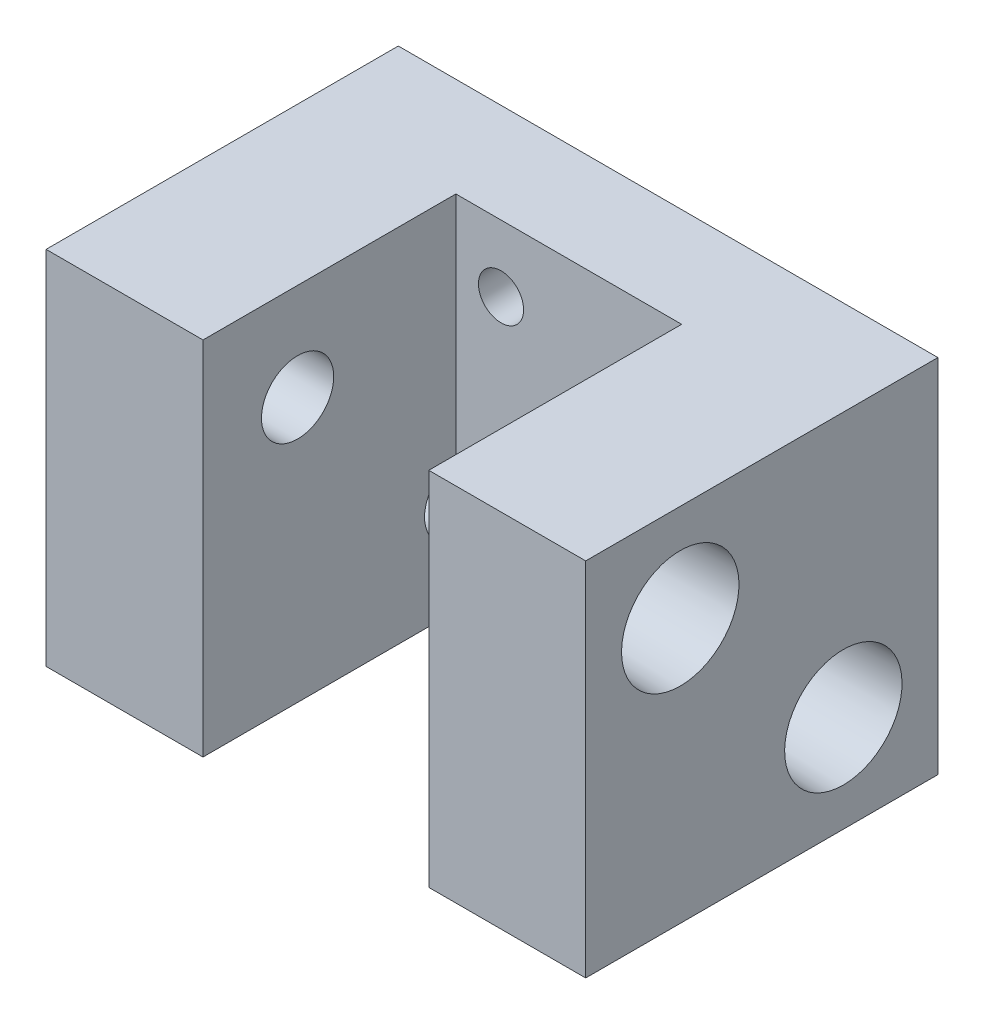
ISO-10303-21;
HEADER;
FILE_DESCRIPTION(('STEP AP214'),'2;1');
FILE_NAME('part.step','',(''),(''),'','','');
FILE_SCHEMA(('AUTOMOTIVE_DESIGN { 1 0 10303 214 1 1 1 1 }'));
ENDSEC;
DATA;
#1=APPLICATION_CONTEXT('core data for automotive mechanical design processes');
#2=APPLICATION_PROTOCOL_DEFINITION('international standard','automotive_design',2000,#1);
#3=PRODUCT_CONTEXT('',#1,'mechanical');
#4=PRODUCT('Part','Part','',(#3));
#5=PRODUCT_RELATED_PRODUCT_CATEGORY('part','',(#4));
#6=PRODUCT_DEFINITION_FORMATION('','',#4);
#7=PRODUCT_DEFINITION_CONTEXT('part definition',#1,'design');
#8=PRODUCT_DEFINITION('design','',#6,#7);
#9=PRODUCT_DEFINITION_SHAPE('','',#8);
#10=(LENGTH_UNIT() NAMED_UNIT(*) SI_UNIT(.MILLI.,.METRE.));
#11=(NAMED_UNIT(*) PLANE_ANGLE_UNIT() SI_UNIT($,.RADIAN.));
#12=(NAMED_UNIT(*) SI_UNIT($,.STERADIAN.) SOLID_ANGLE_UNIT());
#13=UNCERTAINTY_MEASURE_WITH_UNIT(LENGTH_MEASURE(1.E-05),#10,'distance_accuracy_value','');
#14=(GEOMETRIC_REPRESENTATION_CONTEXT(3) GLOBAL_UNCERTAINTY_ASSIGNED_CONTEXT((#13)) GLOBAL_UNIT_ASSIGNED_CONTEXT((#10,
#11,#12)) REPRESENTATION_CONTEXT('',''));
#15=CARTESIAN_POINT('',(0.,0.,0.));
#16=DIRECTION('',(0.,0.,1.));
#17=DIRECTION('',(1.,0.,0.));
#18=AXIS2_PLACEMENT_3D('',#15,#16,#17);
#19=CARTESIAN_POINT('',(3.,63.0546632895546,-10.3999999999999));
#20=DIRECTION('',(0.,0.,-1.));
#21=DIRECTION('',(0.,1.,0.));
#22=AXIS2_PLACEMENT_3D('',#19,#20,#21);
#23=CYLINDRICAL_SURFACE('',#22,1.);
#24=CARTESIAN_POINT('',(3.,63.0546632895546,-21.5999999999999));
#25=DIRECTION('',(0.,0.,1.));
#26=DIRECTION('',(1.,0.,0.));
#27=AXIS2_PLACEMENT_3D('',#24,#25,#26);
#28=CIRCLE('',#27,1.);
#29=CARTESIAN_POINT('',(2.06126340269317,62.7100278287025,-21.5999999999999));
#30=VERTEX_POINT('',#29);
#31=CARTESIAN_POINT('',(3.93873659730683,62.7100278287025,-21.5999999999999));
#32=VERTEX_POINT('',#31);
#33=EDGE_CURVE('E11',#30,#32,#28,.T.);
#34=ORIENTED_EDGE('',*,*,#33,.T.);
#35=CARTESIAN_POINT('',(3.93346732435801,62.6960008377202,-21.8113991832227));
#36=CARTESIAN_POINT('',(3.93346779410747,62.6960010455952,-21.7690096305229));
#37=CARTESIAN_POINT('',(3.93412189671501,62.6976878840924,-21.7266160422993));
#38=CARTESIAN_POINT('',(3.93666250375384,62.7044147373712,-21.6421271568027));
#39=CARTESIAN_POINT('',(3.9385495376887,62.709456192868,-21.6000319955497));
#40=CARTESIAN_POINT('',(3.94580306813724,62.7295857033618,-21.4744640430075));
#41=CARTESIAN_POINT('',(3.95276112683562,62.7496787554676,-21.3918327630391));
#42=CARTESIAN_POINT('',(3.96823833855203,62.8030861306832,-21.2294452046656));
#43=CARTESIAN_POINT('',(3.97678451405811,62.8366431899947,-21.1497727957299));
#44=CARTESIAN_POINT('',(3.99120159116568,62.9162697305843,-20.9966871602835));
#45=CARTESIAN_POINT('',(3.99707557079335,62.9623247176878,-20.9232668118788));
#46=CARTESIAN_POINT('',(4.00078164042691,63.053636621516,-20.8009986957692));
#47=CARTESIAN_POINT('',(4.00018150443712,63.0965285244435,-20.7504353919914));
#48=CARTESIAN_POINT('',(3.99213400471337,63.1879520994135,-20.6553048626963));
#49=CARTESIAN_POINT('',(3.98469804152291,63.2364742638156,-20.6107277953742));
#50=CARTESIAN_POINT('',(3.96272591260842,63.3285071902574,-20.5359217101723));
#51=CARTESIAN_POINT('',(3.94964515064681,63.3714271958892,-20.5045451386882));
#52=CARTESIAN_POINT('',(3.91617104952067,63.4581284528845,-20.4473387758919));
#53=CARTESIAN_POINT('',(3.89578156840252,63.5019092383667,-20.4215060696249));
#54=CARTESIAN_POINT('',(3.84712568949115,63.5883731549848,-20.3755465082987));
#55=CARTESIAN_POINT('',(3.81882820030307,63.6310512119051,-20.3554428209588));
#56=CARTESIAN_POINT('',(3.75465921270358,63.7128349489196,-20.3207969318792));
#57=CARTESIAN_POINT('',(3.71878680095359,63.7519401974108,-20.3062554013858));
#58=CARTESIAN_POINT('',(3.64305634145695,63.8221033083269,-20.2827718754337));
#59=CARTESIAN_POINT('',(3.60363006603177,63.8535259756576,-20.2735184554593));
#60=CARTESIAN_POINT('',(3.52005349204895,63.9102900296901,-20.2583078150473));
#61=CARTESIAN_POINT('',(3.47590268694046,63.9356307633575,-20.2523509484803));
#62=CARTESIAN_POINT('',(3.38259309266117,63.9800699845251,-20.242729761222));
#63=CARTESIAN_POINT('',(3.33331983693886,63.9989448430929,-20.239144197212));
#64=CARTESIAN_POINT('',(3.23232615136308,64.0287259742981,-20.2338080324808));
#65=CARTESIAN_POINT('',(3.18060526099256,64.0396307409825,-20.2320577785153));
#66=CARTESIAN_POINT('',(3.07386803820189,64.0534418259787,-20.22987520105));
#67=CARTESIAN_POINT('',(3.01880441084229,64.0559940161695,-20.2295011467225));
#68=CARTESIAN_POINT('',(2.90900602791832,64.0520293051923,-20.2301081715556));
#69=CARTESIAN_POINT('',(2.85427132414112,64.0455110116506,-20.2310894587692));
#70=CARTESIAN_POINT('',(2.74606178722473,64.0234754179661,-20.2347396246623));
#71=CARTESIAN_POINT('',(2.69260766320677,64.0078591010479,-20.2374271017065));
#72=CARTESIAN_POINT('',(2.58917232395272,63.9680579562828,-20.2452375501811));
#73=CARTESIAN_POINT('',(2.539190900552,63.9438736425598,-20.2503603754843));
#74=CARTESIAN_POINT('',(2.44499586529432,63.888277441421,-20.2639612897336));
#75=CARTESIAN_POINT('',(2.40070330844007,63.8569863427514,-20.2723848421141));
#76=CARTESIAN_POINT('',(2.31836016830776,63.788309515919,-20.2936590193492));
#77=CARTESIAN_POINT('',(2.28030596915993,63.7509273434925,-20.3065070661963));
#78=CARTESIAN_POINT('',(2.21311433223498,63.673778869345,-20.3367903844274));
#79=CARTESIAN_POINT('',(2.18364038236822,63.6342088465254,-20.3539800579781));
#80=CARTESIAN_POINT('',(2.13175411828984,63.553127156375,-20.3935940804294));
#81=CARTESIAN_POINT('',(2.10934092146668,63.5116157324697,-20.416017774454));
#82=CARTESIAN_POINT('',(2.07167740787946,63.429158964274,-20.4657132988123));
#83=CARTESIAN_POINT('',(2.05633463843483,63.3882135297394,-20.4929157267832));
#84=CARTESIAN_POINT('',(2.03168539437225,63.3079116616992,-20.551966356296));
#85=CARTESIAN_POINT('',(2.02238175755831,63.2685559833577,-20.5838167333237));
#86=CARTESIAN_POINT('',(2.00615407659846,63.1777530919607,-20.6648730514994));
#87=CARTESIAN_POINT('',(2.00158301637247,63.1275952382209,-20.71599553343));
#88=CARTESIAN_POINT('',(1.99911292146114,63.034488502204,-20.8246167286346));
#89=CARTESIAN_POINT('',(2.00123000408234,62.991557297309,-20.8821305219353));
#90=CARTESIAN_POINT('',(2.01018735683809,62.904145677128,-21.0172139870247));
#91=CARTESIAN_POINT('',(2.01807733589024,62.8619678487964,-21.0962000896092));
#92=CARTESIAN_POINT('',(2.03460099091979,62.7913562048283,-21.2600384344407));
#93=CARTESIAN_POINT('',(2.04323473832744,62.762923711008,-21.3448912399611));
#94=CARTESIAN_POINT('',(2.05373941226711,62.7310742044806,-21.4752059100529));
#95=CARTESIAN_POINT('',(2.05683947191996,62.7222464666535,-21.5193011119645));
#96=CARTESIAN_POINT('',(2.06185878047469,62.7083285125761,-21.6081375403391));
#97=CARTESIAN_POINT('',(2.06377852120912,62.7032367393982,-21.6528784897575));
#98=CARTESIAN_POINT('',(2.06620158672889,62.6968468611506,-21.7426337019705));
#99=CARTESIAN_POINT('',(2.06670606231062,62.6955456738037,-21.7876477128617));
#100=CARTESIAN_POINT('',(2.06625109578908,62.6967376514783,-21.8776062712289));
#101=CARTESIAN_POINT('',(2.06529170605867,62.6992306807537,-21.9225508211324));
#102=CARTESIAN_POINT('',(2.06052432707542,62.7119055855562,-22.0519401686438));
#103=CARTESIAN_POINT('',(2.05493967469039,62.7269596309379,-22.1358918528647));
#104=CARTESIAN_POINT('',(2.04107602661793,62.7701221094199,-22.3002149928296));
#105=CARTESIAN_POINT('',(2.03279216706232,62.7982541479078,-22.3805796854781));
#106=CARTESIAN_POINT('',(2.01679922450553,62.8684563049749,-22.5394024510893));
#107=CARTESIAN_POINT('',(2.00913212315448,62.9110909594797,-22.6176165374273));
#108=CARTESIAN_POINT('',(1.99984379943087,63.0089654741588,-22.7660648088784));
#109=CARTESIAN_POINT('',(1.99820712480727,63.0641727321202,-22.8363189415603));
#110=CARTESIAN_POINT('',(2.00530778213216,63.1653348538295,-22.945055688105));
#111=CARTESIAN_POINT('',(2.01082968147983,63.208417358496,-22.9864182147362));
#112=CARTESIAN_POINT('',(2.02900073425009,63.2980681501017,-23.0634405842202));
#113=CARTESIAN_POINT('',(2.04164322994268,63.3446331457067,-23.0991057141896));
#114=CARTESIAN_POINT('',(2.07568459166093,63.4396345824421,-23.1641657496826));
#115=CARTESIAN_POINT('',(2.09715663273643,63.4880835233973,-23.193505055692));
#116=CARTESIAN_POINT('',(2.14960586286839,63.5836142228189,-23.2450837792264));
#117=CARTESIAN_POINT('',(2.18057781154089,63.630696719415,-23.2673270973077));
#118=CARTESIAN_POINT('',(2.24706127515276,63.7146450166773,-23.3026520977278));
#119=CARTESIAN_POINT('',(2.28147558861886,63.7520458539033,-23.3165444373022));
#120=CARTESIAN_POINT('',(2.35641758213285,63.8217482002875,-23.3399403413207));
#121=CARTESIAN_POINT('',(2.39694570122793,63.854049342883,-23.3494435903744));
#122=CARTESIAN_POINT('',(2.48215904427106,63.9116572267682,-23.3648328310714));
#123=CARTESIAN_POINT('',(2.52675211281545,63.9370837180094,-23.3707832832007));
#124=CARTESIAN_POINT('',(2.619518559727,63.9808739002524,-23.3802197778207));
#125=CARTESIAN_POINT('',(2.6676924127446,63.9992366529219,-23.3837054929523));
#126=CARTESIAN_POINT('',(2.76876880008568,64.029055844326,-23.3890504489877));
#127=CARTESIAN_POINT('',(2.82178735102414,64.0401351869733,-23.3908228449617));
#128=CARTESIAN_POINT('',(2.92894893964859,64.0535975007012,-23.3929449958671));
#129=CARTESIAN_POINT('',(2.98309218417471,64.0559788576549,-23.3932944867444));
#130=CARTESIAN_POINT('',(3.09245980255755,64.0519206711053,-23.3926739915136));
#131=CARTESIAN_POINT('',(3.14767556532963,64.0452495587968,-23.3916693706878));
#132=CARTESIAN_POINT('',(3.25619534713261,64.0228746836929,-23.387955319185));
#133=CARTESIAN_POINT('',(3.30949917185782,64.0071700055855,-23.3852457157505));
#134=CARTESIAN_POINT('',(3.41253528997474,63.9672748675052,-23.3773971699486));
#135=CARTESIAN_POINT('',(3.46227407162309,63.9431003204514,-23.3722627769479));
#136=CARTESIAN_POINT('',(3.55675052610514,63.8871530065387,-23.3585477297157));
#137=CARTESIAN_POINT('',(3.60149000419317,63.8553829955061,-23.3499683246562));
#138=CARTESIAN_POINT('',(3.68317504474592,63.7867968191116,-23.3286180336696));
#139=CARTESIAN_POINT('',(3.72033174710352,63.7501857319435,-23.3159974417512));
#140=CARTESIAN_POINT('',(3.78766052107156,63.6728985573513,-23.2856651630148));
#141=CARTESIAN_POINT('',(3.8178358974207,63.6322244063623,-23.2679558939529));
#142=CARTESIAN_POINT('',(3.86957631824665,63.5507149496866,-23.2279153299982));
#143=CARTESIAN_POINT('',(3.89146093420019,63.5099649387598,-23.2058207941105));
#144=CARTESIAN_POINT('',(3.92858679691115,63.4284733726766,-23.156635982404));
#145=CARTESIAN_POINT('',(3.94382669254939,63.3877318209221,-23.129544692151));
#146=CARTESIAN_POINT('',(3.9688652904788,63.3060714438638,-23.06946165385));
#147=CARTESIAN_POINT('',(3.97839392752091,63.2652242721172,-23.0362621400375));
#148=CARTESIAN_POINT('',(3.99207021565269,63.1865509415446,-22.965492027614));
#149=CARTESIAN_POINT('',(3.99621432428236,63.1487267868884,-22.9279185690924));
#150=CARTESIAN_POINT('',(4.00145738489488,63.0587847545462,-22.8291066260683));
#151=CARTESIAN_POINT('',(3.99995872001112,63.0091044480125,-22.7655053299516));
#152=CARTESIAN_POINT('',(3.9918991180694,62.919937917925,-22.6317360127953));
#153=CARTESIAN_POINT('',(3.98532566973673,62.8804772111459,-22.5615521394309));
#154=CARTESIAN_POINT('',(3.97070948332591,62.8118038203063,-22.4146209653358));
#155=CARTESIAN_POINT('',(3.96263797672431,62.782831901085,-22.3377643456333));
#156=CARTESIAN_POINT('',(3.94851558213205,62.7370101438142,-22.1804866004489));
#157=CARTESIAN_POINT('',(3.94245954139553,62.720129264317,-22.1000751695247));
#158=CARTESIAN_POINT('',(3.93688777816481,62.7050091871349,-21.9844616184446));
#159=CARTESIAN_POINT('',(3.9356146148201,62.7016340442142,-21.949954678375));
#160=CARTESIAN_POINT('',(3.93390416942215,62.6971297137641,-21.8807657944723));
#161=CARTESIAN_POINT('',(3.9334669399921,62.6960006676294,-21.8460838397594));
#162=CARTESIAN_POINT('',(3.93346732435801,62.6960008377202,-21.8113991832227));
#163=B_SPLINE_CURVE_WITH_KNOTS('',3,(#35,#36,#37,#38,#39,#40,#41,#42,#43,#44,#45,#46,#47,#48,
#49,#50,#51,#52,#53,#54,#55,#56,#57,#58,#59,#60,#61,#62,#63,#64,#65,#66,#67,#68,#69,#70,#71,#72,
#73,#74,#75,#76,#77,#78,#79,#80,#81,#82,#83,#84,#85,#86,#87,#88,#89,#90,#91,#92,#93,#94,#95,#96,
#97,#98,#99,#100,#101,#102,#103,#104,#105,#106,#107,#108,#109,#110,#111,#112,#113,#114,#115,
#116,#117,#118,#119,#120,#121,#122,#123,#124,#125,#126,#127,#128,#129,#130,#131,#132,#133,#134,
#135,#136,#137,#138,#139,#140,#141,#142,#143,#144,#145,#146,#147,#148,#149,#150,#151,#152,#153,
#154,#155,#156,#157,#158,#159,#160,#161,#162),.UNSPECIFIED.,.T.,.F.,(4,2,2,2,2,2,2,2,2,2,2,2,2,
2,2,2,2,2,2,2,2,2,2,2,2,2,2,2,2,2,2,2,2,2,2,2,2,2,2,2,2,2,2,2,2,2,2,2,2,2,2,2,2,2,2,2,2,2,2,2,2,
2,2,4),(0.,0.127133416300975,0.254321468154846,0.509064849455921,0.768623527017854,
1.02788246458198,1.22610158044618,1.42399071225586,1.58755263359473,1.75102834250178,
1.91515604611591,2.07930355057214,2.23238415103819,2.38548118085326,2.54343694651534,
2.70142255028718,2.86602506726532,3.03065285450655,3.19710672581118,3.36355061072221,
3.52735311101164,3.69106033000002,3.84702765919658,4.00297548434902,4.15682185164159,
4.310740459506,4.52484465271464,4.73946519447776,5.00781290338911,5.2761864127476,
5.41127056434507,5.54629838888522,5.68121638620719,5.81612955666676,6.0712743209269,
6.32688141269474,6.59386301626305,6.86016003359156,7.03943115067352,7.21853492755084,
7.39915394335639,7.57967350388663,7.73696092504665,7.89425964677906,8.04861008373245,
8.20298101720116,8.36482020864109,8.52668943183076,8.69277839481723,8.85888418947758,
9.02467956868863,9.1904148841947,9.35058933396083,9.51068780636755,9.66376514690511,
9.81687359926904,9.97674473629223,10.136720998739,10.3775507793022,10.6189762005694,
10.8656365383351,11.1116613303746,11.2156799159803,11.3197050494833),.UNSPECIFIED.);
#164=EDGE_CURVE('E52',#30,#32,#163,.T.);
#165=ORIENTED_EDGE('',*,*,#164,.F.);
#166=EDGE_LOOP('',(#34,#165));
#167=FACE_BOUND('',#166,.T.);
#168=CARTESIAN_POINT('',(3.,63.0546632895546,-24.));
#169=DIRECTION('',(0.,0.,-1.));
#170=DIRECTION('',(0.,1.,0.));
#171=AXIS2_PLACEMENT_3D('',#168,#169,#170);
#172=CIRCLE('',#171,1.);
#173=CARTESIAN_POINT('',(3.,64.0546632895546,-24.));
#174=VERTEX_POINT('',#173);
#175=EDGE_CURVE('E212',#174,#174,#172,.T.);
#176=ORIENTED_EDGE('',*,*,#175,.T.);
#177=EDGE_LOOP('',(#176));
#178=FACE_BOUND('',#177,.T.);
#179=ADVANCED_FACE('F37',(#167,#178),#23,.F.);
#180=CARTESIAN_POINT('',(-3.,73.0546632895546,-10.3999999999999));
#181=DIRECTION('',(0.,0.,-1.));
#182=DIRECTION('',(0.,1.,0.));
#183=AXIS2_PLACEMENT_3D('',#180,#181,#182);
#184=CYLINDRICAL_SURFACE('',#183,1.);
#185=CARTESIAN_POINT('',(-3.,73.0546632895546,-21.5999999999999));
#186=DIRECTION('',(0.,0.,1.));
#187=DIRECTION('',(1.,0.,0.));
#188=AXIS2_PLACEMENT_3D('',#185,#186,#187);
#189=CIRCLE('',#188,1.);
#190=CARTESIAN_POINT('',(-2.,73.0546632895546,-21.5999999999999));
#191=VERTEX_POINT('',#190);
#192=EDGE_CURVE('E126',#191,#191,#189,.T.);
#193=ORIENTED_EDGE('',*,*,#192,.T.);
#194=EDGE_LOOP('',(#193));
#195=FACE_BOUND('',#194,.T.);
#196=CARTESIAN_POINT('',(-3.,73.0546632895546,-24.));
#197=DIRECTION('',(0.,0.,-1.));
#198=DIRECTION('',(0.,1.,0.));
#199=AXIS2_PLACEMENT_3D('',#196,#197,#198);
#200=CIRCLE('',#199,1.);
#201=CARTESIAN_POINT('',(-3.,74.0546632895546,-24.));
#202=VERTEX_POINT('',#201);
#203=EDGE_CURVE('E203',#202,#202,#200,.T.);
#204=ORIENTED_EDGE('',*,*,#203,.T.);
#205=EDGE_LOOP('',(#204));
#206=FACE_BOUND('',#205,.T.);
#207=ADVANCED_FACE('F232',(#195,#206),#184,.F.);
#208=CARTESIAN_POINT('',(-5.,61.7546632895546,-15.9999999999999));
#209=DIRECTION('',(1.,0.,0.));
#210=DIRECTION('',(0.,0.,-1.));
#211=AXIS2_PLACEMENT_3D('',#208,#209,#210);
#212=PLANE('',#211);
#213=CARTESIAN_POINT('',(-5.,64.2960008377202,-21.8113991832227));
#214=DIRECTION('',(1.,0.,0.));
#215=DIRECTION('',(0.,0.,-1.));
#216=AXIS2_PLACEMENT_3D('',#213,#214,#215);
#217=CIRCLE('',#216,1.60000000000001);
#218=CARTESIAN_POINT('',(-5.,65.8819738467379,-21.5999999999999));
#219=VERTEX_POINT('',#218);
#220=CARTESIAN_POINT('',(-5.,62.7100278287025,-21.5999999999999));
#221=VERTEX_POINT('',#220);
#222=EDGE_CURVE('E179',#219,#221,#217,.T.);
#223=ORIENTED_EDGE('',*,*,#222,.F.);
#224=DIRECTION('',(0.,-1.,0.));
#225=VECTOR('',#224,1.);
#226=CARTESIAN_POINT('',(-5.,61.7546632895546,-21.5999999999999));
#227=LINE('',#226,#225);
#228=CARTESIAN_POINT('',(-5.,76.,-21.5999999999999));
#229=VERTEX_POINT('',#228);
#230=EDGE_CURVE('E136',#229,#219,#227,.T.);
#231=ORIENTED_EDGE('',*,*,#230,.F.);
#232=DIRECTION('',(0.,0.,-1.));
#233=VECTOR('',#232,1.);
#234=CARTESIAN_POINT('',(-5.,76.,0.));
#235=LINE('',#234,#233);
#236=CARTESIAN_POINT('',(-5.,76.,-10.3999999999999));
#237=VERTEX_POINT('',#236);
#238=EDGE_CURVE('E159',#237,#229,#235,.T.);
#239=ORIENTED_EDGE('',*,*,#238,.F.);
#240=DIRECTION('',(0.,-1.,0.));
#241=VECTOR('',#240,1.);
#242=CARTESIAN_POINT('',(-5.,0.,-10.3999999999999));
#243=LINE('',#242,#241);
#244=CARTESIAN_POINT('',(-5.,60.,-10.3999999999999));
#245=VERTEX_POINT('',#244);
#246=EDGE_CURVE('E146',#237,#245,#243,.T.);
#247=ORIENTED_EDGE('',*,*,#246,.T.);
#248=DIRECTION('',(0.,0.,-1.));
#249=VECTOR('',#248,1.);
#250=CARTESIAN_POINT('',(-5.,60.,0.));
#251=LINE('',#250,#249);
#252=CARTESIAN_POINT('',(-5.,60.,-21.5999999999999));
#253=VERTEX_POINT('',#252);
#254=EDGE_CURVE('E161',#245,#253,#251,.T.);
#255=ORIENTED_EDGE('',*,*,#254,.T.);
#256=DIRECTION('',(0.,-1.,0.));
#257=VECTOR('',#256,1.);
#258=CARTESIAN_POINT('',(-5.,61.7546632895546,-21.5999999999999));
#259=LINE('',#258,#257);
#260=EDGE_CURVE('E144',#221,#253,#259,.T.);
#261=ORIENTED_EDGE('',*,*,#260,.F.);
#262=EDGE_LOOP('',(#223,#231,#239,#247,#255,#261));
#263=FACE_BOUND('',#262,.T.);
#264=CARTESIAN_POINT('',(-5.,71.7039991622797,-14.5886008167772));
#265=DIRECTION('',(1.,0.,0.));
#266=DIRECTION('',(0.,0.,-1.));
#267=AXIS2_PLACEMENT_3D('',#264,#265,#266);
#268=CIRCLE('',#267,1.6);
#269=CARTESIAN_POINT('',(-5.,71.7039991622797,-16.1886008167772));
#270=VERTEX_POINT('',#269);
#271=EDGE_CURVE('E535',#270,#270,#268,.T.);
#272=ORIENTED_EDGE('',*,*,#271,.F.);
#273=EDGE_LOOP('',(#272));
#274=FACE_BOUND('',#273,.T.);
#275=ADVANCED_FACE('F39',(#263,#274),#212,.T.);
#276=CARTESIAN_POINT('',(-11.95,0.,0.));
#277=DIRECTION('',(1.,0.,0.));
#278=DIRECTION('',(0.,1.,0.));
#279=AXIS2_PLACEMENT_3D('',#276,#277,#278);
#280=PLANE('',#279);
#281=CARTESIAN_POINT('',(-11.95,64.2960008377202,-21.8113991832227));
#282=DIRECTION('',(-1.,0.,0.));
#283=DIRECTION('',(0.,-1.,0.));
#284=AXIS2_PLACEMENT_3D('',#281,#282,#283);
#285=CIRCLE('',#284,2.6);
#286=CARTESIAN_POINT('',(-11.95,61.6960008377202,-21.8113991832227));
#287=VERTEX_POINT('',#286);
#288=EDGE_CURVE('E544',#287,#287,#285,.T.);
#289=ORIENTED_EDGE('',*,*,#288,.F.);
#290=EDGE_LOOP('',(#289));
#291=FACE_BOUND('',#290,.T.);
#292=CARTESIAN_POINT('',(-11.95,71.7039991622797,-14.5886008167772));
#293=DIRECTION('',(-1.,0.,0.));
#294=DIRECTION('',(0.,-1.,0.));
#295=AXIS2_PLACEMENT_3D('',#292,#293,#294);
#296=CIRCLE('',#295,2.60000000000001);
#297=CARTESIAN_POINT('',(-11.95,69.1039991622797,-14.5886008167772));
#298=VERTEX_POINT('',#297);
#299=EDGE_CURVE('E539',#298,#298,#296,.T.);
#300=ORIENTED_EDGE('',*,*,#299,.F.);
#301=EDGE_LOOP('',(#300));
#302=FACE_BOUND('',#301,.T.);
#303=DIRECTION('',(0.,0.,-1.));
#304=VECTOR('',#303,1.);
#305=CARTESIAN_POINT('',(-11.95,76.,0.));
#306=LINE('',#305,#304);
#307=CARTESIAN_POINT('',(-11.95,76.,-10.3999999999999));
#308=VERTEX_POINT('',#307);
#309=CARTESIAN_POINT('',(-11.95,76.,-26.));
#310=VERTEX_POINT('',#309);
#311=EDGE_CURVE('E151',#308,#310,#306,.T.);
#312=ORIENTED_EDGE('',*,*,#311,.T.);
#313=DIRECTION('',(0.,-1.,0.));
#314=VECTOR('',#313,1.);
#315=CARTESIAN_POINT('',(-11.95,0.,-26.));
#316=LINE('',#315,#314);
#317=CARTESIAN_POINT('',(-11.95,60.,-26.));
#318=VERTEX_POINT('',#317);
#319=EDGE_CURVE('E147',#310,#318,#316,.T.);
#320=ORIENTED_EDGE('',*,*,#319,.T.);
#321=DIRECTION('',(0.,0.,-1.));
#322=VECTOR('',#321,1.);
#323=CARTESIAN_POINT('',(-11.95,60.,0.));
#324=LINE('',#323,#322);
#325=CARTESIAN_POINT('',(-11.95,60.,-10.3999999999999));
#326=VERTEX_POINT('',#325);
#327=EDGE_CURVE('E152',#326,#318,#324,.T.);
#328=ORIENTED_EDGE('',*,*,#327,.F.);
#329=DIRECTION('',(0.,-1.,0.));
#330=VECTOR('',#329,1.);
#331=CARTESIAN_POINT('',(-11.95,0.,-10.3999999999999));
#332=LINE('',#331,#330);
#333=EDGE_CURVE('E156',#308,#326,#332,.T.);
#334=ORIENTED_EDGE('',*,*,#333,.F.);
#335=EDGE_LOOP('',(#312,#320,#328,#334));
#336=FACE_BOUND('',#335,.T.);
#337=ADVANCED_FACE('F475',(#291,#302,#336),#280,.F.);
#338=CARTESIAN_POINT('',(17.3463643575415,0.,-26.));
#339=DIRECTION('',(0.,0.,-1.));
#340=DIRECTION('',(0.,1.,0.));
#341=AXIS2_PLACEMENT_3D('',#338,#339,#340);
#342=PLANE('',#341);
#343=CARTESIAN_POINT('',(-3.,73.0546632895546,-26.));
#344=DIRECTION('',(0.,0.,-1.));
#345=DIRECTION('',(0.,1.,0.));
#346=AXIS2_PLACEMENT_3D('',#343,#344,#345);
#347=CIRCLE('',#346,2.1);
#348=CARTESIAN_POINT('',(-3.,75.1546632895546,-26.));
#349=VERTEX_POINT('',#348);
#350=EDGE_CURVE('E206',#349,#349,#347,.T.);
#351=ORIENTED_EDGE('',*,*,#350,.F.);
#352=EDGE_LOOP('',(#351));
#353=FACE_BOUND('',#352,.T.);
#354=CARTESIAN_POINT('',(3.,63.0546632895546,-26.));
#355=DIRECTION('',(0.,0.,-1.));
#356=DIRECTION('',(0.,1.,0.));
#357=AXIS2_PLACEMENT_3D('',#354,#355,#356);
#358=CIRCLE('',#357,2.1);
#359=CARTESIAN_POINT('',(3.,65.1546632895546,-26.));
#360=VERTEX_POINT('',#359);
#361=EDGE_CURVE('E188',#360,#360,#358,.T.);
#362=ORIENTED_EDGE('',*,*,#361,.F.);
#363=EDGE_LOOP('',(#362));
#364=FACE_BOUND('',#363,.T.);
#365=DIRECTION('',(-1.,0.,0.));
#366=VECTOR('',#365,1.);
#367=CARTESIAN_POINT('',(17.3463643575415,76.,-26.));
#368=LINE('',#367,#366);
#369=CARTESIAN_POINT('',(11.95,76.,-26.));
#370=VERTEX_POINT('',#369);
#371=EDGE_CURVE('E46',#370,#310,#368,.T.);
#372=ORIENTED_EDGE('',*,*,#371,.F.);
#373=DIRECTION('',(0.,-1.,0.));
#374=VECTOR('',#373,1.);
#375=CARTESIAN_POINT('',(11.95,61.7546632895546,-26.));
#376=LINE('',#375,#374);
#377=CARTESIAN_POINT('',(11.95,60.,-26.));
#378=VERTEX_POINT('',#377);
#379=EDGE_CURVE('E559',#370,#378,#376,.T.);
#380=ORIENTED_EDGE('',*,*,#379,.T.);
#381=DIRECTION('',(-1.,0.,0.));
#382=VECTOR('',#381,1.);
#383=CARTESIAN_POINT('',(17.3463643575415,60.,-26.));
#384=LINE('',#383,#382);
#385=EDGE_CURVE('E150',#378,#318,#384,.T.);
#386=ORIENTED_EDGE('',*,*,#385,.T.);
#387=ORIENTED_EDGE('',*,*,#319,.F.);
#388=EDGE_LOOP('',(#372,#380,#386,#387));
#389=FACE_BOUND('',#388,.T.);
#390=ADVANCED_FACE('F463',(#353,#364,#389),#342,.T.);
#391=CARTESIAN_POINT('',(17.3463643575415,60.,0.));
#392=DIRECTION('',(0.,1.,0.));
#393=DIRECTION('',(-1.,0.,0.));
#394=AXIS2_PLACEMENT_3D('',#391,#392,#393);
#395=PLANE('',#394);
#396=ORIENTED_EDGE('',*,*,#327,.T.);
#397=ORIENTED_EDGE('',*,*,#385,.F.);
#398=DIRECTION('',(0.,0.,-1.));
#399=VECTOR('',#398,1.);
#400=CARTESIAN_POINT('',(11.95,60.,-15.9999999999999));
#401=LINE('',#400,#399);
#402=CARTESIAN_POINT('',(11.95,60.,-10.3999999999999));
#403=VERTEX_POINT('',#402);
#404=EDGE_CURVE('E562',#403,#378,#401,.T.);
#405=ORIENTED_EDGE('',*,*,#404,.F.);
#406=DIRECTION('',(-1.,0.,0.));
#407=VECTOR('',#406,1.);
#408=CARTESIAN_POINT('',(34.2963643575415,60.,-10.3999999999999));
#409=LINE('',#408,#407);
#410=CARTESIAN_POINT('',(5.,60.,-10.3999999999999));
#411=VERTEX_POINT('',#410);
#412=EDGE_CURVE('E569',#403,#411,#409,.T.);
#413=ORIENTED_EDGE('',*,*,#412,.T.);
#414=DIRECTION('',(0.,0.,1.));
#415=VECTOR('',#414,1.);
#416=CARTESIAN_POINT('',(5.,60.,-15.9999999999999));
#417=LINE('',#416,#415);
#418=CARTESIAN_POINT('',(5.,60.,-21.5999999999999));
#419=VERTEX_POINT('',#418);
#420=EDGE_CURVE('E567',#419,#411,#417,.T.);
#421=ORIENTED_EDGE('',*,*,#420,.F.);
#422=DIRECTION('',(-1.,0.,0.));
#423=VECTOR('',#422,1.);
#424=CARTESIAN_POINT('',(21.5939748101532,60.,-21.5999999999999));
#425=LINE('',#424,#423);
#426=EDGE_CURVE('E133',#419,#253,#425,.T.);
#427=ORIENTED_EDGE('',*,*,#426,.T.);
#428=ORIENTED_EDGE('',*,*,#254,.F.);
#429=DIRECTION('',(-1.,0.,0.));
#430=VECTOR('',#429,1.);
#431=CARTESIAN_POINT('',(17.3463643575415,60.,-10.3999999999999));
#432=LINE('',#431,#430);
#433=EDGE_CURVE('E155',#245,#326,#432,.T.);
#434=ORIENTED_EDGE('',*,*,#433,.T.);
#435=EDGE_LOOP('',(#396,#397,#405,#413,#421,#427,#428,#434));
#436=FACE_BOUND('',#435,.T.);
#437=ADVANCED_FACE('F458',(#436),#395,.F.);
#438=CARTESIAN_POINT('',(17.3463643575415,0.,-10.3999999999999));
#439=DIRECTION('',(0.,0.,-1.));
#440=DIRECTION('',(0.,1.,0.));
#441=AXIS2_PLACEMENT_3D('',#438,#439,#440);
#442=PLANE('',#441);
#443=ORIENTED_EDGE('',*,*,#246,.F.);
#444=DIRECTION('',(-1.,0.,0.));
#445=VECTOR('',#444,1.);
#446=CARTESIAN_POINT('',(17.3463643575415,76.,-10.3999999999999));
#447=LINE('',#446,#445);
#448=EDGE_CURVE('E154',#237,#308,#447,.T.);
#449=ORIENTED_EDGE('',*,*,#448,.T.);
#450=ORIENTED_EDGE('',*,*,#333,.T.);
#451=ORIENTED_EDGE('',*,*,#433,.F.);
#452=EDGE_LOOP('',(#443,#449,#450,#451));
#453=FACE_BOUND('',#452,.T.);
#454=ADVANCED_FACE('F275',(#453),#442,.F.);
#455=CARTESIAN_POINT('',(17.3463643575415,76.,0.));
#456=DIRECTION('',(0.,1.,0.));
#457=DIRECTION('',(-1.,0.,0.));
#458=AXIS2_PLACEMENT_3D('',#455,#456,#457);
#459=PLANE('',#458);
#460=ORIENTED_EDGE('',*,*,#238,.T.);
#461=DIRECTION('',(-1.,0.,0.));
#462=VECTOR('',#461,1.);
#463=CARTESIAN_POINT('',(21.5939748101532,76.,-21.5999999999999));
#464=LINE('',#463,#462);
#465=CARTESIAN_POINT('',(5.,76.,-21.5999999999999));
#466=VERTEX_POINT('',#465);
#467=EDGE_CURVE('E579',#466,#229,#464,.T.);
#468=ORIENTED_EDGE('',*,*,#467,.F.);
#469=DIRECTION('',(0.,0.,1.));
#470=VECTOR('',#469,1.);
#471=CARTESIAN_POINT('',(5.,76.,-15.9999999999999));
#472=LINE('',#471,#470);
#473=CARTESIAN_POINT('',(5.,76.,-10.3999999999999));
#474=VERTEX_POINT('',#473);
#475=EDGE_CURVE('E549',#466,#474,#472,.T.);
#476=ORIENTED_EDGE('',*,*,#475,.T.);
#477=DIRECTION('',(-1.,0.,0.));
#478=VECTOR('',#477,1.);
#479=CARTESIAN_POINT('',(34.2963643575415,76.,-10.3999999999999));
#480=LINE('',#479,#478);
#481=CARTESIAN_POINT('',(11.95,76.,-10.3999999999999));
#482=VERTEX_POINT('',#481);
#483=EDGE_CURVE('E556',#482,#474,#480,.T.);
#484=ORIENTED_EDGE('',*,*,#483,.F.);
#485=DIRECTION('',(0.,0.,-1.));
#486=VECTOR('',#485,1.);
#487=CARTESIAN_POINT('',(11.95,76.,-15.9999999999999));
#488=LINE('',#487,#486);
#489=EDGE_CURVE('E555',#482,#370,#488,.T.);
#490=ORIENTED_EDGE('',*,*,#489,.T.);
#491=ORIENTED_EDGE('',*,*,#371,.T.);
#492=ORIENTED_EDGE('',*,*,#311,.F.);
#493=ORIENTED_EDGE('',*,*,#448,.F.);
#494=EDGE_LOOP('',(#460,#468,#476,#484,#490,#491,#492,#493));
#495=FACE_BOUND('',#494,.T.);
#496=ADVANCED_FACE('F268',(#495),#459,.T.);
#497=CARTESIAN_POINT('',(21.5939748101532,0.,-21.5999999999999));
#498=DIRECTION('',(0.,0.,1.));
#499=DIRECTION('',(1.,0.,0.));
#500=AXIS2_PLACEMENT_3D('',#497,#498,#499);
#501=PLANE('',#500);
#502=ORIENTED_EDGE('',*,*,#192,.F.);
#503=EDGE_LOOP('',(#502));
#504=FACE_BOUND('',#503,.T.);
#505=ORIENTED_EDGE('',*,*,#467,.T.);
#506=ORIENTED_EDGE('',*,*,#230,.T.);
#507=DIRECTION('',(-1.,0.,0.));
#508=VECTOR('',#507,1.);
#509=CARTESIAN_POINT('',(21.5939748101532,65.8819738467379,-21.5999999999999));
#510=LINE('',#509,#508);
#511=CARTESIAN_POINT('',(5.,65.8819738467379,-21.5999999999999));
#512=VERTEX_POINT('',#511);
#513=EDGE_CURVE('E139',#512,#219,#510,.T.);
#514=ORIENTED_EDGE('',*,*,#513,.F.);
#515=DIRECTION('',(0.,1.,0.));
#516=VECTOR('',#515,1.);
#517=CARTESIAN_POINT('',(5.,0.,-21.5999999999999));
#518=LINE('',#517,#516);
#519=EDGE_CURVE('E576',#512,#466,#518,.T.);
#520=ORIENTED_EDGE('',*,*,#519,.T.);
#521=EDGE_LOOP('',(#505,#506,#514,#520));
#522=FACE_BOUND('',#521,.T.);
#523=ADVANCED_FACE('F266',(#504,#522),#501,.T.);
#524=CARTESIAN_POINT('',(21.5939748101532,64.2960008377202,-21.8113991832227));
#525=DIRECTION('',(-1.,0.,0.));
#526=DIRECTION('',(0.,-1.,0.));
#527=AXIS2_PLACEMENT_3D('',#524,#525,#526);
#528=CYLINDRICAL_SURFACE('',#527,1.60000000000002);
#529=CARTESIAN_POINT('',(8.05,64.2960008377202,-21.8113991832227));
#530=DIRECTION('',(-1.,0.,0.));
#531=DIRECTION('',(0.,-1.,0.));
#532=AXIS2_PLACEMENT_3D('',#529,#530,#531);
#533=CIRCLE('',#532,1.60000000000002);
#534=CARTESIAN_POINT('',(8.05,62.6960008377202,-21.8113991832227));
#535=VERTEX_POINT('',#534);
#536=EDGE_CURVE('E41',#535,#535,#533,.F.);
#537=ORIENTED_EDGE('',*,*,#536,.T.);
#538=EDGE_LOOP('',(#537));
#539=FACE_BOUND('',#538,.T.);
#540=DIRECTION('',(-1.,0.,0.));
#541=VECTOR('',#540,1.);
#542=CARTESIAN_POINT('',(21.5939748101532,62.7100278287025,-21.5999999999999));
#543=LINE('',#542,#541);
#544=EDGE_CURVE('E59',#30,#221,#543,.T.);
#545=ORIENTED_EDGE('',*,*,#544,.F.);
#546=ORIENTED_EDGE('',*,*,#164,.T.);
#547=CARTESIAN_POINT('',(5.,62.7100278287025,-21.5999999999999));
#548=VERTEX_POINT('',#547);
#549=EDGE_CURVE('E125',#548,#32,#543,.T.);
#550=ORIENTED_EDGE('',*,*,#549,.F.);
#551=CARTESIAN_POINT('',(5.,64.2960008377202,-21.8113991832227));
#552=DIRECTION('',(1.,0.,0.));
#553=DIRECTION('',(0.,0.,-1.));
#554=AXIS2_PLACEMENT_3D('',#551,#552,#553);
#555=CIRCLE('',#554,1.60000000000001);
#556=EDGE_CURVE('E175',#512,#548,#555,.T.);
#557=ORIENTED_EDGE('',*,*,#556,.F.);
#558=ORIENTED_EDGE('',*,*,#513,.T.);
#559=ORIENTED_EDGE('',*,*,#222,.T.);
#560=EDGE_LOOP('',(#545,#546,#550,#557,#558,#559));
#561=FACE_BOUND('',#560,.T.);
#562=CARTESIAN_POINT('',(-8.05,64.2960008377202,-21.8113991832227));
#563=DIRECTION('',(-1.,0.,0.));
#564=DIRECTION('',(0.,-1.,0.));
#565=AXIS2_PLACEMENT_3D('',#562,#563,#564);
#566=CIRCLE('',#565,1.60000000000001);
#567=CARTESIAN_POINT('',(-8.05,62.6960008377202,-21.8113991832227));
#568=VERTEX_POINT('',#567);
#569=EDGE_CURVE('E172',#568,#568,#566,.T.);
#570=ORIENTED_EDGE('',*,*,#569,.T.);
#571=EDGE_LOOP('',(#570));
#572=FACE_BOUND('',#571,.T.);
#573=ADVANCED_FACE('F123',(#539,#561,#572),#528,.F.);
#574=ORIENTED_EDGE('',*,*,#33,.F.);
#575=ORIENTED_EDGE('',*,*,#544,.T.);
#576=ORIENTED_EDGE('',*,*,#260,.T.);
#577=ORIENTED_EDGE('',*,*,#426,.F.);
#578=DIRECTION('',(0.,1.,0.));
#579=VECTOR('',#578,1.);
#580=CARTESIAN_POINT('',(5.,0.,-21.5999999999999));
#581=LINE('',#580,#579);
#582=EDGE_CURVE('E132',#419,#548,#581,.T.);
#583=ORIENTED_EDGE('',*,*,#582,.T.);
#584=ORIENTED_EDGE('',*,*,#549,.T.);
#585=EDGE_LOOP('',(#574,#575,#576,#577,#583,#584));
#586=FACE_BOUND('',#585,.T.);
#587=ADVANCED_FACE('F130',(#586),#501,.T.);
#588=CARTESIAN_POINT('',(34.2963643575415,61.7546632895546,-10.3999999999999));
#589=DIRECTION('',(0.,0.,1.));
#590=DIRECTION('',(0.,-1.,0.));
#591=AXIS2_PLACEMENT_3D('',#588,#589,#590);
#592=PLANE('',#591);
#593=DIRECTION('',(0.,-1.,0.));
#594=VECTOR('',#593,1.);
#595=CARTESIAN_POINT('',(11.95,61.7546632895546,-10.3999999999999));
#596=LINE('',#595,#594);
#597=EDGE_CURVE('E553',#482,#403,#596,.T.);
#598=ORIENTED_EDGE('',*,*,#597,.F.);
#599=ORIENTED_EDGE('',*,*,#483,.T.);
#600=DIRECTION('',(0.,1.,0.));
#601=VECTOR('',#600,1.);
#602=CARTESIAN_POINT('',(5.,61.7546632895546,-10.3999999999999));
#603=LINE('',#602,#601);
#604=EDGE_CURVE('E564',#411,#474,#603,.T.);
#605=ORIENTED_EDGE('',*,*,#604,.F.);
#606=ORIENTED_EDGE('',*,*,#412,.F.);
#607=EDGE_LOOP('',(#598,#599,#605,#606));
#608=FACE_BOUND('',#607,.T.);
#609=ADVANCED_FACE('F262',(#608),#592,.T.);
#610=CARTESIAN_POINT('',(5.,0.,0.));
#611=DIRECTION('',(1.,0.,0.));
#612=DIRECTION('',(0.,0.,-1.));
#613=AXIS2_PLACEMENT_3D('',#610,#611,#612);
#614=PLANE('',#613);
#615=CARTESIAN_POINT('',(5.,71.7039991622797,-14.5886008167772));
#616=DIRECTION('',(1.,0.,0.));
#617=DIRECTION('',(0.,0.,-1.));
#618=AXIS2_PLACEMENT_3D('',#615,#616,#617);
#619=CIRCLE('',#618,1.6);
#620=CARTESIAN_POINT('',(5.,71.7039991622797,-16.1886008167772));
#621=VERTEX_POINT('',#620);
#622=EDGE_CURVE('E178',#621,#621,#619,.T.);
#623=ORIENTED_EDGE('',*,*,#622,.T.);
#624=EDGE_LOOP('',(#623));
#625=FACE_BOUND('',#624,.T.);
#626=ORIENTED_EDGE('',*,*,#519,.F.);
#627=ORIENTED_EDGE('',*,*,#556,.T.);
#628=ORIENTED_EDGE('',*,*,#582,.F.);
#629=ORIENTED_EDGE('',*,*,#420,.T.);
#630=ORIENTED_EDGE('',*,*,#604,.T.);
#631=ORIENTED_EDGE('',*,*,#475,.F.);
#632=EDGE_LOOP('',(#626,#627,#628,#629,#630,#631));
#633=FACE_BOUND('',#632,.T.);
#634=ADVANCED_FACE('F258',(#625,#633),#614,.F.);
#635=CARTESIAN_POINT('',(11.95,0.,0.));
#636=DIRECTION('',(-1.,0.,0.));
#637=DIRECTION('',(0.,1.,0.));
#638=AXIS2_PLACEMENT_3D('',#635,#636,#637);
#639=PLANE('',#638);
#640=CARTESIAN_POINT('',(11.95,71.7039991622797,-14.5886008167772));
#641=DIRECTION('',(-1.,0.,0.));
#642=DIRECTION('',(0.,-1.,0.));
#643=AXIS2_PLACEMENT_3D('',#640,#641,#642);
#644=CIRCLE('',#643,2.60000000000001);
#645=CARTESIAN_POINT('',(11.95,69.1039991622797,-14.5886008167772));
#646=VERTEX_POINT('',#645);
#647=EDGE_CURVE('E190',#646,#646,#644,.T.);
#648=ORIENTED_EDGE('',*,*,#647,.T.);
#649=EDGE_LOOP('',(#648));
#650=FACE_BOUND('',#649,.T.);
#651=CARTESIAN_POINT('',(11.95,64.2960008377202,-21.8113991832227));
#652=DIRECTION('',(-1.,0.,0.));
#653=DIRECTION('',(0.,-1.,0.));
#654=AXIS2_PLACEMENT_3D('',#651,#652,#653);
#655=CIRCLE('',#654,2.6);
#656=CARTESIAN_POINT('',(11.95,61.6960008377202,-21.8113991832227));
#657=VERTEX_POINT('',#656);
#658=EDGE_CURVE('E195',#657,#657,#655,.T.);
#659=ORIENTED_EDGE('',*,*,#658,.T.);
#660=EDGE_LOOP('',(#659));
#661=FACE_BOUND('',#660,.T.);
#662=ORIENTED_EDGE('',*,*,#489,.F.);
#663=ORIENTED_EDGE('',*,*,#597,.T.);
#664=ORIENTED_EDGE('',*,*,#404,.T.);
#665=ORIENTED_EDGE('',*,*,#379,.F.);
#666=EDGE_LOOP('',(#662,#663,#664,#665));
#667=FACE_BOUND('',#666,.T.);
#668=ADVANCED_FACE('F251',(#650,#661,#667),#639,.F.);
#669=CARTESIAN_POINT('',(-11.95,71.7039991622797,-14.5886008167772));
#670=DIRECTION('',(-1.,0.,0.));
#671=DIRECTION('',(0.,-1.,0.));
#672=AXIS2_PLACEMENT_3D('',#669,#670,#671);
#673=CONICAL_SURFACE('',#672,2.60000000000001,0.026179938779915);
#674=CARTESIAN_POINT('',(-8.05,71.7039991622797,-14.5886008167772));
#675=DIRECTION('',(-1.,0.,0.));
#676=DIRECTION('',(0.,-1.,0.));
#677=AXIS2_PLACEMENT_3D('',#674,#675,#676);
#678=CIRCLE('',#677,2.49787490588018);
#679=CARTESIAN_POINT('',(-8.05,69.2061242563996,-14.5886008167772));
#680=VERTEX_POINT('',#679);
#681=EDGE_CURVE('E536',#680,#680,#678,.T.);
#682=ORIENTED_EDGE('',*,*,#681,.F.);
#683=EDGE_LOOP('',(#682));
#684=FACE_BOUND('',#683,.T.);
#685=ORIENTED_EDGE('',*,*,#299,.T.);
#686=EDGE_LOOP('',(#685));
#687=FACE_BOUND('',#686,.T.);
#688=ADVANCED_FACE('F248',(#684,#687),#673,.F.);
#689=CARTESIAN_POINT('',(-8.05,71.7039991622797,-14.5886008167772));
#690=DIRECTION('',(-1.,0.,0.));
#691=DIRECTION('',(0.,-1.,0.));
#692=AXIS2_PLACEMENT_3D('',#689,#690,#691);
#693=PLANE('',#692);
#694=CARTESIAN_POINT('',(-8.05,71.7039991622797,-14.5886008167772));
#695=DIRECTION('',(-1.,0.,0.));
#696=DIRECTION('',(0.,-1.,0.));
#697=AXIS2_PLACEMENT_3D('',#694,#695,#696);
#698=CIRCLE('',#697,1.6);
#699=CARTESIAN_POINT('',(-8.05,70.1039991622797,-14.5886008167772));
#700=VERTEX_POINT('',#699);
#701=EDGE_CURVE('E176',#700,#700,#698,.T.);
#702=ORIENTED_EDGE('',*,*,#701,.F.);
#703=EDGE_LOOP('',(#702));
#704=FACE_BOUND('',#703,.T.);
#705=ORIENTED_EDGE('',*,*,#681,.T.);
#706=EDGE_LOOP('',(#705));
#707=FACE_BOUND('',#706,.T.);
#708=ADVANCED_FACE('F246',(#704,#707),#693,.T.);
#709=CARTESIAN_POINT('',(-11.95,64.2960008377202,-21.8113991832227));
#710=DIRECTION('',(-1.,0.,0.));
#711=DIRECTION('',(0.,-1.,0.));
#712=AXIS2_PLACEMENT_3D('',#709,#710,#711);
#713=CONICAL_SURFACE('',#712,2.6,0.026179938779915);
#714=CARTESIAN_POINT('',(-8.05,64.2960008377202,-21.8113991832227));
#715=DIRECTION('',(-1.,0.,0.));
#716=DIRECTION('',(0.,-1.,0.));
#717=AXIS2_PLACEMENT_3D('',#714,#715,#716);
#718=CIRCLE('',#717,2.49787490588018);
#719=CARTESIAN_POINT('',(-8.05,61.79812593184,-21.8113991832227));
#720=VERTEX_POINT('',#719);
#721=EDGE_CURVE('E547',#720,#720,#718,.T.);
#722=ORIENTED_EDGE('',*,*,#721,.F.);
#723=EDGE_LOOP('',(#722));
#724=FACE_BOUND('',#723,.T.);
#725=ORIENTED_EDGE('',*,*,#288,.T.);
#726=EDGE_LOOP('',(#725));
#727=FACE_BOUND('',#726,.T.);
#728=ADVANCED_FACE('F242',(#724,#727),#713,.F.);
#729=CARTESIAN_POINT('',(-8.05,64.2960008377202,-21.8113991832227));
#730=DIRECTION('',(-1.,0.,0.));
#731=DIRECTION('',(0.,-1.,0.));
#732=AXIS2_PLACEMENT_3D('',#729,#730,#731);
#733=PLANE('',#732);
#734=ORIENTED_EDGE('',*,*,#569,.F.);
#735=EDGE_LOOP('',(#734));
#736=FACE_BOUND('',#735,.T.);
#737=ORIENTED_EDGE('',*,*,#721,.T.);
#738=EDGE_LOOP('',(#737));
#739=FACE_BOUND('',#738,.T.);
#740=ADVANCED_FACE('F238',(#736,#739),#733,.T.);
#741=CARTESIAN_POINT('',(11.95,71.7039991622797,-14.5886008167772));
#742=DIRECTION('',(-1.,0.,0.));
#743=DIRECTION('',(0.,-1.,0.));
#744=AXIS2_PLACEMENT_3D('',#741,#742,#743);
#745=CYLINDRICAL_SURFACE('',#744,1.6);
#746=ORIENTED_EDGE('',*,*,#271,.T.);
#747=EDGE_LOOP('',(#746));
#748=FACE_BOUND('',#747,.T.);
#749=ORIENTED_EDGE('',*,*,#701,.T.);
#750=EDGE_LOOP('',(#749));
#751=FACE_BOUND('',#750,.T.);
#752=ADVANCED_FACE('F234',(#748,#751),#745,.F.);
#753=CARTESIAN_POINT('',(8.05,71.7039991622797,-14.5886008167772));
#754=DIRECTION('',(-1.,0.,0.));
#755=DIRECTION('',(0.,-1.,0.));
#756=AXIS2_PLACEMENT_3D('',#753,#754,#755);
#757=CIRCLE('',#756,1.6);
#758=CARTESIAN_POINT('',(8.05,70.1039991622797,-14.5886008167772));
#759=VERTEX_POINT('',#758);
#760=EDGE_CURVE('E182',#759,#759,#757,.F.);
#761=ORIENTED_EDGE('',*,*,#760,.T.);
#762=EDGE_LOOP('',(#761));
#763=FACE_BOUND('',#762,.T.);
#764=ORIENTED_EDGE('',*,*,#622,.F.);
#765=EDGE_LOOP('',(#764));
#766=FACE_BOUND('',#765,.T.);
#767=ADVANCED_FACE('F237',(#763,#766),#745,.F.);
#768=CARTESIAN_POINT('',(-3.,73.0546632895546,-24.));
#769=DIRECTION('',(0.,0.,-1.));
#770=DIRECTION('',(0.,1.,0.));
#771=AXIS2_PLACEMENT_3D('',#768,#769,#770);
#772=CYLINDRICAL_SURFACE('',#771,2.1);
#773=CARTESIAN_POINT('',(-3.,73.0546632895546,-24.));
#774=DIRECTION('',(0.,0.,-1.));
#775=DIRECTION('',(0.,1.,0.));
#776=AXIS2_PLACEMENT_3D('',#773,#774,#775);
#777=CIRCLE('',#776,2.1);
#778=CARTESIAN_POINT('',(-3.,75.1546632895546,-24.));
#779=VERTEX_POINT('',#778);
#780=EDGE_CURVE('E127',#779,#779,#777,.T.);
#781=ORIENTED_EDGE('',*,*,#780,.F.);
#782=EDGE_LOOP('',(#781));
#783=FACE_BOUND('',#782,.T.);
#784=ORIENTED_EDGE('',*,*,#350,.T.);
#785=EDGE_LOOP('',(#784));
#786=FACE_BOUND('',#785,.T.);
#787=ADVANCED_FACE('F327',(#783,#786),#772,.F.);
#788=CARTESIAN_POINT('',(0.,0.,-24.));
#789=DIRECTION('',(0.,0.,-1.));
#790=DIRECTION('',(0.,1.,0.));
#791=AXIS2_PLACEMENT_3D('',#788,#789,#790);
#792=PLANE('',#791);
#793=ORIENTED_EDGE('',*,*,#203,.F.);
#794=EDGE_LOOP('',(#793));
#795=FACE_BOUND('',#794,.T.);
#796=ORIENTED_EDGE('',*,*,#780,.T.);
#797=EDGE_LOOP('',(#796));
#798=FACE_BOUND('',#797,.T.);
#799=ADVANCED_FACE('F334',(#795,#798),#792,.T.);
#800=CARTESIAN_POINT('',(3.,63.0546632895546,-24.));
#801=DIRECTION('',(0.,0.,-1.));
#802=DIRECTION('',(0.,1.,0.));
#803=AXIS2_PLACEMENT_3D('',#800,#801,#802);
#804=CYLINDRICAL_SURFACE('',#803,2.1);
#805=CARTESIAN_POINT('',(3.,63.0546632895546,-24.));
#806=DIRECTION('',(0.,0.,-1.));
#807=DIRECTION('',(0.,1.,0.));
#808=AXIS2_PLACEMENT_3D('',#805,#806,#807);
#809=CIRCLE('',#808,2.1);
#810=CARTESIAN_POINT('',(3.,65.1546632895546,-24.));
#811=VERTEX_POINT('',#810);
#812=EDGE_CURVE('E211',#811,#811,#809,.T.);
#813=ORIENTED_EDGE('',*,*,#812,.F.);
#814=EDGE_LOOP('',(#813));
#815=FACE_BOUND('',#814,.T.);
#816=ORIENTED_EDGE('',*,*,#361,.T.);
#817=EDGE_LOOP('',(#816));
#818=FACE_BOUND('',#817,.T.);
#819=ADVANCED_FACE('F343',(#815,#818),#804,.F.);
#820=CARTESIAN_POINT('',(0.,0.,-24.));
#821=DIRECTION('',(0.,0.,-1.));
#822=DIRECTION('',(0.,1.,0.));
#823=AXIS2_PLACEMENT_3D('',#820,#821,#822);
#824=PLANE('',#823);
#825=ORIENTED_EDGE('',*,*,#175,.F.);
#826=EDGE_LOOP('',(#825));
#827=FACE_BOUND('',#826,.T.);
#828=ORIENTED_EDGE('',*,*,#812,.T.);
#829=EDGE_LOOP('',(#828));
#830=FACE_BOUND('',#829,.T.);
#831=ADVANCED_FACE('F351',(#827,#830),#824,.T.);
#832=CARTESIAN_POINT('',(8.05,71.7039991622797,-14.5886008167772));
#833=DIRECTION('',(-1.,0.,0.));
#834=DIRECTION('',(0.,-1.,0.));
#835=AXIS2_PLACEMENT_3D('',#832,#833,#834);
#836=PLANE('',#835);
#837=CARTESIAN_POINT('',(8.05,71.7039991622797,-14.5886008167772));
#838=DIRECTION('',(-1.,0.,0.));
#839=DIRECTION('',(0.,-1.,0.));
#840=AXIS2_PLACEMENT_3D('',#837,#838,#839);
#841=CIRCLE('',#840,2.49787490588018);
#842=CARTESIAN_POINT('',(8.05,69.2061242563996,-14.5886008167772));
#843=VERTEX_POINT('',#842);
#844=EDGE_CURVE('E184',#843,#843,#841,.T.);
#845=ORIENTED_EDGE('',*,*,#844,.F.);
#846=EDGE_LOOP('',(#845));
#847=FACE_BOUND('',#846,.T.);
#848=ORIENTED_EDGE('',*,*,#760,.F.);
#849=EDGE_LOOP('',(#848));
#850=FACE_BOUND('',#849,.T.);
#851=ADVANCED_FACE('F358',(#847,#850),#836,.F.);
#852=CARTESIAN_POINT('',(11.95,71.7039991622797,-14.5886008167772));
#853=DIRECTION('',(1.,0.,0.));
#854=DIRECTION('',(0.,-1.,0.));
#855=AXIS2_PLACEMENT_3D('',#852,#853,#854);
#856=CONICAL_SURFACE('',#855,2.60000000000001,0.026179938779915);
#857=ORIENTED_EDGE('',*,*,#844,.T.);
#858=EDGE_LOOP('',(#857));
#859=FACE_BOUND('',#858,.T.);
#860=ORIENTED_EDGE('',*,*,#647,.F.);
#861=EDGE_LOOP('',(#860));
#862=FACE_BOUND('',#861,.T.);
#863=ADVANCED_FACE('F365',(#859,#862),#856,.F.);
#864=CARTESIAN_POINT('',(8.05,64.2960008377202,-21.8113991832227));
#865=DIRECTION('',(-1.,0.,0.));
#866=DIRECTION('',(0.,-1.,0.));
#867=AXIS2_PLACEMENT_3D('',#864,#865,#866);
#868=PLANE('',#867);
#869=CARTESIAN_POINT('',(8.05,64.2960008377202,-21.8113991832227));
#870=DIRECTION('',(-1.,0.,0.));
#871=DIRECTION('',(0.,-1.,0.));
#872=AXIS2_PLACEMENT_3D('',#869,#870,#871);
#873=CIRCLE('',#872,2.49787490588018);
#874=CARTESIAN_POINT('',(8.05,61.79812593184,-21.8113991832227));
#875=VERTEX_POINT('',#874);
#876=EDGE_CURVE('E198',#875,#875,#873,.T.);
#877=ORIENTED_EDGE('',*,*,#876,.F.);
#878=EDGE_LOOP('',(#877));
#879=FACE_BOUND('',#878,.T.);
#880=ORIENTED_EDGE('',*,*,#536,.F.);
#881=EDGE_LOOP('',(#880));
#882=FACE_BOUND('',#881,.T.);
#883=ADVANCED_FACE('F373',(#879,#882),#868,.F.);
#884=CARTESIAN_POINT('',(11.95,64.2960008377202,-21.8113991832227));
#885=DIRECTION('',(1.,0.,0.));
#886=DIRECTION('',(0.,-1.,0.));
#887=AXIS2_PLACEMENT_3D('',#884,#885,#886);
#888=CONICAL_SURFACE('',#887,2.6,0.026179938779915);
#889=ORIENTED_EDGE('',*,*,#876,.T.);
#890=EDGE_LOOP('',(#889));
#891=FACE_BOUND('',#890,.T.);
#892=ORIENTED_EDGE('',*,*,#658,.F.);
#893=EDGE_LOOP('',(#892));
#894=FACE_BOUND('',#893,.T.);
#895=ADVANCED_FACE('F380',(#891,#894),#888,.F.);
#896=CLOSED_SHELL('',(#179,#207,#275,#337,#390,#437,#454,#496,#523,#573,#587,#609,#634,#668,
#688,#708,#728,#740,#752,#767,#787,#799,#819,#831,#851,#863,#883,#895));
#897=MANIFOLD_SOLID_BREP('B2',#896);
#898=ADVANCED_BREP_SHAPE_REPRESENTATION('',(#18,#897),#14);
#899=SHAPE_DEFINITION_REPRESENTATION(#9,#898);
ENDSEC;
END-ISO-10303-21;
